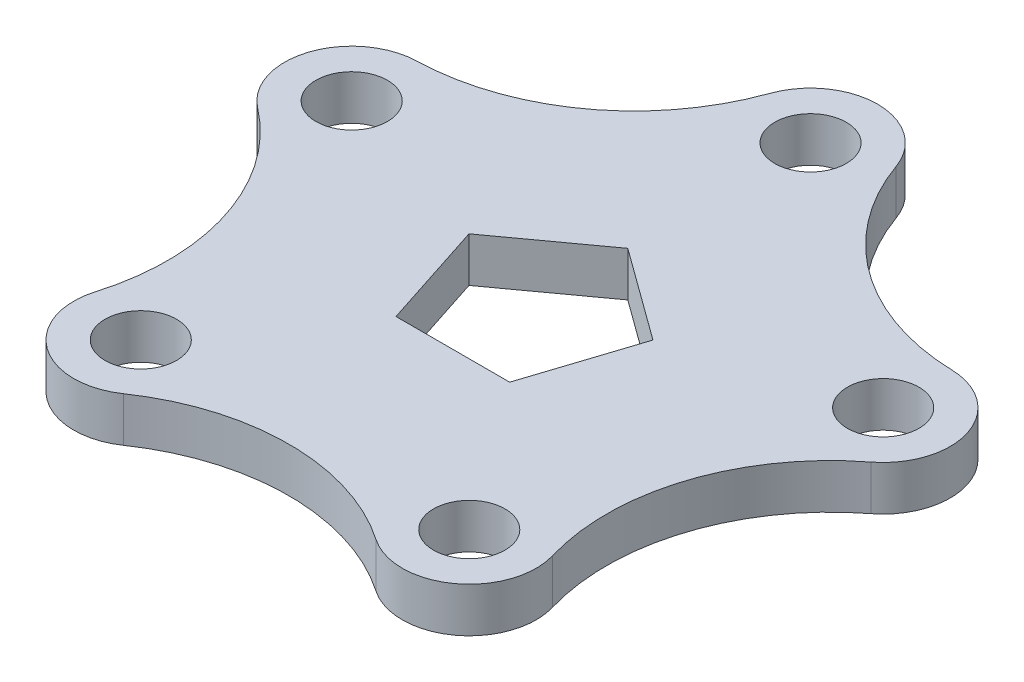
ISO-10303-21;
HEADER;
FILE_DESCRIPTION(('STEP AP214'),'2;1');
FILE_NAME('part.step','',(''),(''),'','','');
FILE_SCHEMA(('AUTOMOTIVE_DESIGN { 1 0 10303 214 1 1 1 1 }'));
ENDSEC;
DATA;
#1=APPLICATION_CONTEXT('core data for automotive mechanical design processes');
#2=APPLICATION_PROTOCOL_DEFINITION('international standard','automotive_design',2000,#1);
#3=PRODUCT_CONTEXT('',#1,'mechanical');
#4=PRODUCT('Part','Part','',(#3));
#5=PRODUCT_RELATED_PRODUCT_CATEGORY('part','',(#4));
#6=PRODUCT_DEFINITION_FORMATION('','',#4);
#7=PRODUCT_DEFINITION_CONTEXT('part definition',#1,'design');
#8=PRODUCT_DEFINITION('design','',#6,#7);
#9=PRODUCT_DEFINITION_SHAPE('','',#8);
#10=(LENGTH_UNIT() NAMED_UNIT(*) SI_UNIT(.MILLI.,.METRE.));
#11=(NAMED_UNIT(*) PLANE_ANGLE_UNIT() SI_UNIT($,.RADIAN.));
#12=(NAMED_UNIT(*) SI_UNIT($,.STERADIAN.) SOLID_ANGLE_UNIT());
#13=UNCERTAINTY_MEASURE_WITH_UNIT(LENGTH_MEASURE(1.E-05),#10,'distance_accuracy_value','');
#14=(GEOMETRIC_REPRESENTATION_CONTEXT(3) GLOBAL_UNCERTAINTY_ASSIGNED_CONTEXT((#13)) GLOBAL_UNIT_ASSIGNED_CONTEXT((#10,
#11,#12)) REPRESENTATION_CONTEXT('',''));
#15=CARTESIAN_POINT('',(0.,0.,0.));
#16=DIRECTION('',(0.,0.,1.));
#17=DIRECTION('',(1.,0.,0.));
#18=AXIS2_PLACEMENT_3D('',#15,#16,#17);
#19=CARTESIAN_POINT('',(10.2862419151183,10.,-14.1577974015616));
#20=DIRECTION('',(-0.587785252292472,0.,0.809016994374948));
#21=DIRECTION('',(0.809016994374948,0.,0.587785252292472));
#22=AXIS2_PLACEMENT_3D('',#19,#20,#21);
#23=PLANE('',#22);
#24=DIRECTION('',(-0.809016994374948,0.,-0.587785252292472));
#25=VECTOR('',#24,1.);
#26=CARTESIAN_POINT('',(10.2862419151183,0.,-14.1577974015616));
#27=LINE('',#26,#25);
#28=CARTESIAN_POINT('',(20.5724838302366,0.,-6.68440519687687));
#29=VERTEX_POINT('',#28);
#30=CARTESIAN_POINT('',(0.,0.,-21.6311896062463));
#31=VERTEX_POINT('',#30);
#32=EDGE_CURVE('E253',#29,#31,#27,.T.);
#33=ORIENTED_EDGE('',*,*,#32,.F.);
#34=DIRECTION('',(0.,-1.,0.));
#35=VECTOR('',#34,1.);
#36=CARTESIAN_POINT('',(20.5724838302366,10.,-6.68440519687687));
#37=LINE('',#36,#35);
#38=CARTESIAN_POINT('',(20.5724838302366,10.,-6.68440519687687));
#39=VERTEX_POINT('',#38);
#40=EDGE_CURVE('E11',#39,#29,#37,.T.);
#41=ORIENTED_EDGE('',*,*,#40,.F.);
#42=DIRECTION('',(-0.809016994374948,0.,-0.587785252292472));
#43=VECTOR('',#42,1.);
#44=CARTESIAN_POINT('',(10.2862419151183,10.,-14.1577974015616));
#45=LINE('',#44,#43);
#46=CARTESIAN_POINT('',(0.,10.,-21.6311896062463));
#47=VERTEX_POINT('',#46);
#48=EDGE_CURVE('E397',#39,#47,#45,.T.);
#49=ORIENTED_EDGE('',*,*,#48,.T.);
#50=DIRECTION('',(0.,-1.,0.));
#51=VECTOR('',#50,1.);
#52=CARTESIAN_POINT('',(0.,10.,-21.6311896062463));
#53=LINE('',#52,#51);
#54=EDGE_CURVE('E70',#47,#31,#53,.T.);
#55=ORIENTED_EDGE('',*,*,#54,.T.);
#56=EDGE_LOOP('',(#33,#41,#49,#55));
#57=FACE_BOUND('',#56,.T.);
#58=ADVANCED_FACE('F50',(#57),#23,.T.);
#59=CARTESIAN_POINT('',(16.6434890351652,10.,5.40779740156155));
#60=DIRECTION('',(-0.951056516295154,0.,-0.309016994374946));
#61=DIRECTION('',(-0.309016994374946,0.,0.951056516295154));
#62=AXIS2_PLACEMENT_3D('',#59,#60,#61);
#63=PLANE('',#62);
#64=DIRECTION('',(0.309016994374946,0.,-0.951056516295154));
#65=VECTOR('',#64,1.);
#66=CARTESIAN_POINT('',(16.6434890351652,0.,5.40779740156155));
#67=LINE('',#66,#65);
#68=CARTESIAN_POINT('',(12.7144942400938,0.,17.5));
#69=VERTEX_POINT('',#68);
#70=EDGE_CURVE('E257',#69,#29,#67,.T.);
#71=ORIENTED_EDGE('',*,*,#70,.F.);
#72=DIRECTION('',(0.,-1.,0.));
#73=VECTOR('',#72,1.);
#74=CARTESIAN_POINT('',(12.7144942400938,10.,17.5));
#75=LINE('',#74,#73);
#76=CARTESIAN_POINT('',(12.7144942400938,10.,17.5));
#77=VERTEX_POINT('',#76);
#78=EDGE_CURVE('E59',#77,#69,#75,.T.);
#79=ORIENTED_EDGE('',*,*,#78,.F.);
#80=DIRECTION('',(0.309016994374946,0.,-0.951056516295154));
#81=VECTOR('',#80,1.);
#82=CARTESIAN_POINT('',(16.6434890351652,10.,5.40779740156155));
#83=LINE('',#82,#81);
#84=EDGE_CURVE('E185',#77,#39,#83,.T.);
#85=ORIENTED_EDGE('',*,*,#84,.T.);
#86=ORIENTED_EDGE('',*,*,#40,.T.);
#87=EDGE_LOOP('',(#71,#79,#85,#86));
#88=FACE_BOUND('',#87,.T.);
#89=ADVANCED_FACE('F404',(#88),#63,.T.);
#90=CARTESIAN_POINT('',(0.,10.,17.5));
#91=DIRECTION('',(0.,0.,-1.));
#92=DIRECTION('',(-1.,0.,0.));
#93=AXIS2_PLACEMENT_3D('',#90,#91,#92);
#94=PLANE('',#93);
#95=DIRECTION('',(1.,0.,0.));
#96=VECTOR('',#95,1.);
#97=CARTESIAN_POINT('',(0.,0.,17.5));
#98=LINE('',#97,#96);
#99=CARTESIAN_POINT('',(-12.7144942400938,0.,17.5));
#100=VERTEX_POINT('',#99);
#101=EDGE_CURVE('E167',#100,#69,#98,.T.);
#102=ORIENTED_EDGE('',*,*,#101,.F.);
#103=DIRECTION('',(0.,-1.,0.));
#104=VECTOR('',#103,1.);
#105=CARTESIAN_POINT('',(-12.7144942400938,10.,17.5));
#106=LINE('',#105,#104);
#107=CARTESIAN_POINT('',(-12.7144942400938,10.,17.5));
#108=VERTEX_POINT('',#107);
#109=EDGE_CURVE('E162',#108,#100,#106,.T.);
#110=ORIENTED_EDGE('',*,*,#109,.F.);
#111=DIRECTION('',(1.,0.,0.));
#112=VECTOR('',#111,1.);
#113=CARTESIAN_POINT('',(0.,10.,17.5));
#114=LINE('',#113,#112);
#115=EDGE_CURVE('E165',#108,#77,#114,.T.);
#116=ORIENTED_EDGE('',*,*,#115,.T.);
#117=ORIENTED_EDGE('',*,*,#78,.T.);
#118=EDGE_LOOP('',(#102,#110,#116,#117));
#119=FACE_BOUND('',#118,.T.);
#120=ADVANCED_FACE('F163',(#119),#94,.T.);
#121=CARTESIAN_POINT('',(-16.6434890351652,10.,5.4077974015616));
#122=DIRECTION('',(0.951056516295153,0.,-0.309016994374949));
#123=DIRECTION('',(-0.309016994374949,0.,-0.951056516295153));
#124=AXIS2_PLACEMENT_3D('',#121,#122,#123);
#125=PLANE('',#124);
#126=DIRECTION('',(0.309016994374949,0.,0.951056516295153));
#127=VECTOR('',#126,1.);
#128=CARTESIAN_POINT('',(-16.6434890351652,0.,5.4077974015616));
#129=LINE('',#128,#127);
#130=CARTESIAN_POINT('',(-20.5724838302366,0.,-6.68440519687681));
#131=VERTEX_POINT('',#130);
#132=EDGE_CURVE('E261',#131,#100,#129,.T.);
#133=ORIENTED_EDGE('',*,*,#132,.F.);
#134=DIRECTION('',(0.,-1.,0.));
#135=VECTOR('',#134,1.);
#136=CARTESIAN_POINT('',(-20.5724838302366,10.,-6.68440519687681));
#137=LINE('',#136,#135);
#138=CARTESIAN_POINT('',(-20.5724838302366,10.,-6.68440519687681));
#139=VERTEX_POINT('',#138);
#140=EDGE_CURVE('E111',#139,#131,#137,.T.);
#141=ORIENTED_EDGE('',*,*,#140,.F.);
#142=DIRECTION('',(0.309016994374949,0.,0.951056516295153));
#143=VECTOR('',#142,1.);
#144=CARTESIAN_POINT('',(-16.6434890351652,10.,5.4077974015616));
#145=LINE('',#144,#143);
#146=EDGE_CURVE('E179',#139,#108,#145,.T.);
#147=ORIENTED_EDGE('',*,*,#146,.T.);
#148=ORIENTED_EDGE('',*,*,#109,.T.);
#149=EDGE_LOOP('',(#133,#141,#147,#148));
#150=FACE_BOUND('',#149,.T.);
#151=ADVANCED_FACE('F184',(#150),#125,.T.);
#152=CARTESIAN_POINT('',(-61.2393120472351,10.,-84.288681923909));
#153=DIRECTION('',(0.,-1.,0.));
#154=DIRECTION('',(0.,0.,-1.));
#155=AXIS2_PLACEMENT_3D('',#152,#153,#154);
#156=CYLINDRICAL_SURFACE('',#155,50.);
#157=CARTESIAN_POINT('',(-61.2393120472351,0.,-84.288681923909));
#158=DIRECTION('',(0.,1.,0.));
#159=DIRECTION('',(0.,0.,1.));
#160=AXIS2_PLACEMENT_3D('',#157,#158,#159);
#161=CIRCLE('',#160,50.);
#162=CARTESIAN_POINT('',(-59.8560199097059,0.,-34.3078205581591));
#163=VERTEX_POINT('',#162);
#164=CARTESIAN_POINT('',(-14.1321489339774,0.,-67.528157367056));
#165=VERTEX_POINT('',#164);
#166=EDGE_CURVE('E215',#163,#165,#161,.T.);
#167=ORIENTED_EDGE('',*,*,#166,.F.);
#168=DIRECTION('',(0.,-1.,0.));
#169=VECTOR('',#168,1.);
#170=CARTESIAN_POINT('',(-59.8560199097059,10.,-34.3078205581591));
#171=LINE('',#170,#169);
#172=CARTESIAN_POINT('',(-59.8560199097059,10.,-34.3078205581591));
#173=VERTEX_POINT('',#172);
#174=EDGE_CURVE('E51',#173,#163,#171,.T.);
#175=ORIENTED_EDGE('',*,*,#174,.F.);
#176=CARTESIAN_POINT('',(-61.2393120472351,10.,-84.288681923909));
#177=DIRECTION('',(0.,1.,0.));
#178=DIRECTION('',(0.,0.,1.));
#179=AXIS2_PLACEMENT_3D('',#176,#177,#178);
#180=CIRCLE('',#179,50.);
#181=CARTESIAN_POINT('',(-14.1321489339774,10.,-67.528157367056));
#182=VERTEX_POINT('',#181);
#183=EDGE_CURVE('E290',#173,#182,#180,.T.);
#184=ORIENTED_EDGE('',*,*,#183,.T.);
#185=DIRECTION('',(0.,-1.,0.));
#186=VECTOR('',#185,1.);
#187=CARTESIAN_POINT('',(-14.1321489339774,10.,-67.528157367056));
#188=LINE('',#187,#186);
#189=EDGE_CURVE('E211',#182,#165,#188,.T.);
#190=ORIENTED_EDGE('',*,*,#189,.T.);
#191=EDGE_LOOP('',(#167,#175,#184,#190));
#192=FACE_BOUND('',#191,.T.);
#193=ADVANCED_FACE('F47',(#192),#156,.F.);
#194=CARTESIAN_POINT('',(-59.4410322684471,10.,-19.3135621484342));
#195=DIRECTION('',(0.,-1.,0.));
#196=DIRECTION('',(0.,0.,-1.));
#197=AXIS2_PLACEMENT_3D('',#194,#195,#196);
#198=CYLINDRICAL_SURFACE('',#197,15.);
#199=CARTESIAN_POINT('',(-59.4410322684471,0.,-19.3135621484342));
#200=DIRECTION('',(0.,1.,0.));
#201=DIRECTION('',(0.,0.,1.));
#202=AXIS2_PLACEMENT_3D('',#199,#200,#201);
#203=CIRCLE('',#202,15.);
#204=CARTESIAN_POINT('',(-68.5901682849799,0.,-7.42687589233322));
#205=VERTEX_POINT('',#204);
#206=EDGE_CURVE('E216',#163,#205,#203,.T.);
#207=ORIENTED_EDGE('',*,*,#206,.T.);
#208=DIRECTION('',(0.,-1.,0.));
#209=VECTOR('',#208,1.);
#210=CARTESIAN_POINT('',(-68.5901682849799,10.,-7.42687589233322));
#211=LINE('',#210,#209);
#212=CARTESIAN_POINT('',(-68.5901682849799,10.,-7.42687589233322));
#213=VERTEX_POINT('',#212);
#214=EDGE_CURVE('E317',#213,#205,#211,.T.);
#215=ORIENTED_EDGE('',*,*,#214,.F.);
#216=CARTESIAN_POINT('',(-59.4410322684471,10.,-19.3135621484342));
#217=DIRECTION('',(0.,1.,0.));
#218=DIRECTION('',(0.,0.,1.));
#219=AXIS2_PLACEMENT_3D('',#216,#217,#218);
#220=CIRCLE('',#219,15.);
#221=EDGE_CURVE('E326',#173,#213,#220,.T.);
#222=ORIENTED_EDGE('',*,*,#221,.F.);
#223=ORIENTED_EDGE('',*,*,#174,.T.);
#224=EDGE_LOOP('',(#207,#215,#222,#223));
#225=FACE_BOUND('',#224,.T.);
#226=ADVANCED_FACE('F329',(#225),#198,.T.);
#227=CARTESIAN_POINT('',(-99.0872883400891,10.,32.1954116280032));
#228=DIRECTION('',(0.,-1.,0.));
#229=DIRECTION('',(0.,0.,-1.));
#230=AXIS2_PLACEMENT_3D('',#227,#228,#229);
#231=CYLINDRICAL_SURFACE('',#230,50.);
#232=CARTESIAN_POINT('',(-99.0872883400891,0.,32.1954116280032));
#233=DIRECTION('',(0.,1.,0.));
#234=DIRECTION('',(0.,0.,1.));
#235=AXIS2_PLACEMENT_3D('',#232,#233,#234);
#236=CIRCLE('',#235,50.);
#237=CARTESIAN_POINT('',(-51.1252036694663,0.,46.3247581821809));
#238=VERTEX_POINT('',#237);
#239=EDGE_CURVE('E225',#238,#205,#236,.T.);
#240=ORIENTED_EDGE('',*,*,#239,.F.);
#241=DIRECTION('',(0.,-1.,0.));
#242=VECTOR('',#241,1.);
#243=CARTESIAN_POINT('',(-51.1252036694663,10.,46.3247581821809));
#244=LINE('',#243,#242);
#245=CARTESIAN_POINT('',(-51.1252036694663,10.,46.3247581821809));
#246=VERTEX_POINT('',#245);
#247=EDGE_CURVE('E320',#246,#238,#244,.T.);
#248=ORIENTED_EDGE('',*,*,#247,.F.);
#249=CARTESIAN_POINT('',(-99.0872883400891,10.,32.1954116280032));
#250=DIRECTION('',(0.,1.,0.));
#251=DIRECTION('',(0.,0.,1.));
#252=AXIS2_PLACEMENT_3D('',#249,#250,#251);
#253=CIRCLE('',#252,50.);
#254=EDGE_CURVE('E371',#246,#213,#253,.T.);
#255=ORIENTED_EDGE('',*,*,#254,.T.);
#256=ORIENTED_EDGE('',*,*,#214,.T.);
#257=EDGE_LOOP('',(#240,#248,#255,#256));
#258=FACE_BOUND('',#257,.T.);
#259=ADVANCED_FACE('F375',(#258),#231,.F.);
#260=CARTESIAN_POINT('',(-36.7365782682796,10.,50.5635621484342));
#261=DIRECTION('',(0.,-1.,0.));
#262=DIRECTION('',(0.,0.,-1.));
#263=AXIS2_PLACEMENT_3D('',#260,#261,#262);
#264=CYLINDRICAL_SURFACE('',#263,15.);
#265=CARTESIAN_POINT('',(-36.7365782682796,0.,50.5635621484342));
#266=DIRECTION('',(0.,1.,0.));
#267=DIRECTION('',(0.,0.,1.));
#268=AXIS2_PLACEMENT_3D('',#265,#266,#267);
#269=CIRCLE('',#268,15.);
#270=CARTESIAN_POINT('',(-28.2589063602152,0.,62.9380956353668));
#271=VERTEX_POINT('',#270);
#272=EDGE_CURVE('E226',#238,#271,#269,.T.);
#273=ORIENTED_EDGE('',*,*,#272,.T.);
#274=DIRECTION('',(0.,-1.,0.));
#275=VECTOR('',#274,1.);
#276=CARTESIAN_POINT('',(-28.2589063602152,10.,62.9380956353668));
#277=LINE('',#276,#275);
#278=CARTESIAN_POINT('',(-28.2589063602152,10.,62.9380956353668));
#279=VERTEX_POINT('',#278);
#280=EDGE_CURVE('E312',#279,#271,#277,.T.);
#281=ORIENTED_EDGE('',*,*,#280,.F.);
#282=CARTESIAN_POINT('',(-36.7365782682796,10.,50.5635621484342));
#283=DIRECTION('',(0.,1.,0.));
#284=DIRECTION('',(0.,0.,1.));
#285=AXIS2_PLACEMENT_3D('',#282,#283,#284);
#286=CIRCLE('',#285,15.);
#287=EDGE_CURVE('E373',#246,#279,#286,.T.);
#288=ORIENTED_EDGE('',*,*,#287,.F.);
#289=ORIENTED_EDGE('',*,*,#247,.T.);
#290=EDGE_LOOP('',(#273,#281,#288,#289));
#291=FACE_BOUND('',#290,.T.);
#292=ADVANCED_FACE('F372',(#291),#264,.T.);
#293=CARTESIAN_POINT('',(-5.96744875736022E-13,10.,104.186540591808));
#294=DIRECTION('',(0.,-1.,0.));
#295=DIRECTION('',(0.,0.,-1.));
#296=AXIS2_PLACEMENT_3D('',#293,#294,#295);
#297=CYLINDRICAL_SURFACE('',#296,50.);
#298=CARTESIAN_POINT('',(-5.96744875736022E-13,0.,104.186540591808));
#299=DIRECTION('',(0.,1.,0.));
#300=DIRECTION('',(0.,0.,1.));
#301=AXIS2_PLACEMENT_3D('',#298,#299,#300);
#302=CIRCLE('',#301,50.);
#303=CARTESIAN_POINT('',(28.258906360215,0.,62.9380956353667));
#304=VERTEX_POINT('',#303);
#305=EDGE_CURVE('E229',#304,#271,#302,.T.);
#306=ORIENTED_EDGE('',*,*,#305,.F.);
#307=DIRECTION('',(0.,-1.,0.));
#308=VECTOR('',#307,1.);
#309=CARTESIAN_POINT('',(28.258906360215,10.,62.9380956353667));
#310=LINE('',#309,#308);
#311=CARTESIAN_POINT('',(28.258906360215,10.,62.9380956353667));
#312=VERTEX_POINT('',#311);
#313=EDGE_CURVE('E311',#312,#304,#310,.T.);
#314=ORIENTED_EDGE('',*,*,#313,.F.);
#315=CARTESIAN_POINT('',(-5.96744875736022E-13,10.,104.186540591808));
#316=DIRECTION('',(0.,1.,0.));
#317=DIRECTION('',(0.,0.,1.));
#318=AXIS2_PLACEMENT_3D('',#315,#316,#317);
#319=CIRCLE('',#318,50.);
#320=EDGE_CURVE('E367',#312,#279,#319,.T.);
#321=ORIENTED_EDGE('',*,*,#320,.T.);
#322=ORIENTED_EDGE('',*,*,#280,.T.);
#323=EDGE_LOOP('',(#306,#314,#321,#322));
#324=FACE_BOUND('',#323,.T.);
#325=ADVANCED_FACE('F362',(#324),#297,.F.);
#326=CARTESIAN_POINT('',(36.7365782682796,10.,50.5635621484342));
#327=DIRECTION('',(0.,-1.,0.));
#328=DIRECTION('',(0.,0.,-1.));
#329=AXIS2_PLACEMENT_3D('',#326,#327,#328);
#330=CYLINDRICAL_SURFACE('',#329,15.);
#331=CARTESIAN_POINT('',(36.7365782682796,0.,50.5635621484342));
#332=DIRECTION('',(0.,1.,0.));
#333=DIRECTION('',(0.,0.,1.));
#334=AXIS2_PLACEMENT_3D('',#331,#332,#333);
#335=CIRCLE('',#334,15.);
#336=CARTESIAN_POINT('',(51.1252036694663,0.,46.3247581821811));
#337=VERTEX_POINT('',#336);
#338=EDGE_CURVE('E233',#304,#337,#335,.T.);
#339=ORIENTED_EDGE('',*,*,#338,.T.);
#340=DIRECTION('',(0.,-1.,0.));
#341=VECTOR('',#340,1.);
#342=CARTESIAN_POINT('',(51.1252036694663,10.,46.3247581821811));
#343=LINE('',#342,#341);
#344=CARTESIAN_POINT('',(51.1252036694663,10.,46.3247581821811));
#345=VERTEX_POINT('',#344);
#346=EDGE_CURVE('E306',#345,#337,#343,.T.);
#347=ORIENTED_EDGE('',*,*,#346,.F.);
#348=CARTESIAN_POINT('',(36.7365782682796,10.,50.5635621484342));
#349=DIRECTION('',(0.,1.,0.));
#350=DIRECTION('',(0.,0.,1.));
#351=AXIS2_PLACEMENT_3D('',#348,#349,#350);
#352=CIRCLE('',#351,15.);
#353=EDGE_CURVE('E387',#312,#345,#352,.T.);
#354=ORIENTED_EDGE('',*,*,#353,.F.);
#355=ORIENTED_EDGE('',*,*,#313,.T.);
#356=EDGE_LOOP('',(#339,#347,#354,#355));
#357=FACE_BOUND('',#356,.T.);
#358=ADVANCED_FACE('F361',(#357),#330,.T.);
#359=CARTESIAN_POINT('',(99.0872883400888,10.,32.1954116280044));
#360=DIRECTION('',(0.,-1.,0.));
#361=DIRECTION('',(0.,0.,-1.));
#362=AXIS2_PLACEMENT_3D('',#359,#360,#361);
#363=CYLINDRICAL_SURFACE('',#362,50.);
#364=CARTESIAN_POINT('',(99.0872883400888,0.,32.1954116280044));
#365=DIRECTION('',(0.,1.,0.));
#366=DIRECTION('',(0.,0.,1.));
#367=AXIS2_PLACEMENT_3D('',#364,#365,#366);
#368=CIRCLE('',#367,50.);
#369=CARTESIAN_POINT('',(68.5901682849798,0.,-7.42687589233313));
#370=VERTEX_POINT('',#369);
#371=EDGE_CURVE('E239',#370,#337,#368,.T.);
#372=ORIENTED_EDGE('',*,*,#371,.F.);
#373=DIRECTION('',(0.,-1.,0.));
#374=VECTOR('',#373,1.);
#375=CARTESIAN_POINT('',(68.5901682849798,10.,-7.42687589233313));
#376=LINE('',#375,#374);
#377=CARTESIAN_POINT('',(68.5901682849798,10.,-7.42687589233313));
#378=VERTEX_POINT('',#377);
#379=EDGE_CURVE('E304',#378,#370,#376,.T.);
#380=ORIENTED_EDGE('',*,*,#379,.F.);
#381=CARTESIAN_POINT('',(99.0872883400888,10.,32.1954116280044));
#382=DIRECTION('',(0.,1.,0.));
#383=DIRECTION('',(0.,0.,1.));
#384=AXIS2_PLACEMENT_3D('',#381,#382,#383);
#385=CIRCLE('',#384,50.);
#386=EDGE_CURVE('E358',#378,#345,#385,.T.);
#387=ORIENTED_EDGE('',*,*,#386,.T.);
#388=ORIENTED_EDGE('',*,*,#346,.T.);
#389=EDGE_LOOP('',(#372,#380,#387,#388));
#390=FACE_BOUND('',#389,.T.);
#391=ADVANCED_FACE('F354',(#390),#363,.F.);
#392=CARTESIAN_POINT('',(59.4410322684472,10.,-19.3135621484343));
#393=DIRECTION('',(0.,-1.,0.));
#394=DIRECTION('',(0.,0.,-1.));
#395=AXIS2_PLACEMENT_3D('',#392,#393,#394);
#396=CYLINDRICAL_SURFACE('',#395,14.9999999999999);
#397=CARTESIAN_POINT('',(59.4410322684472,0.,-19.3135621484343));
#398=DIRECTION('',(0.,1.,0.));
#399=DIRECTION('',(0.,0.,1.));
#400=AXIS2_PLACEMENT_3D('',#397,#398,#399);
#401=CIRCLE('',#400,14.9999999999999);
#402=CARTESIAN_POINT('',(59.8560199097062,0.,-34.307820558159));
#403=VERTEX_POINT('',#402);
#404=EDGE_CURVE('E242',#370,#403,#401,.T.);
#405=ORIENTED_EDGE('',*,*,#404,.T.);
#406=DIRECTION('',(0.,-1.,0.));
#407=VECTOR('',#406,1.);
#408=CARTESIAN_POINT('',(59.8560199097062,10.,-34.307820558159));
#409=LINE('',#408,#407);
#410=CARTESIAN_POINT('',(59.8560199097062,10.,-34.307820558159));
#411=VERTEX_POINT('',#410);
#412=EDGE_CURVE('E302',#411,#403,#409,.T.);
#413=ORIENTED_EDGE('',*,*,#412,.F.);
#414=CARTESIAN_POINT('',(59.4410322684472,10.,-19.3135621484343));
#415=DIRECTION('',(0.,1.,0.));
#416=DIRECTION('',(0.,0.,1.));
#417=AXIS2_PLACEMENT_3D('',#414,#415,#416);
#418=CIRCLE('',#417,14.9999999999999);
#419=EDGE_CURVE('E392',#378,#411,#418,.T.);
#420=ORIENTED_EDGE('',*,*,#419,.F.);
#421=ORIENTED_EDGE('',*,*,#379,.T.);
#422=EDGE_LOOP('',(#405,#413,#420,#421));
#423=FACE_BOUND('',#422,.T.);
#424=ADVANCED_FACE('F349',(#423),#396,.T.);
#425=CARTESIAN_POINT('',(61.2393120472361,10.,-84.2886819239083));
#426=DIRECTION('',(0.,-1.,0.));
#427=DIRECTION('',(0.,0.,-1.));
#428=AXIS2_PLACEMENT_3D('',#425,#426,#427);
#429=CYLINDRICAL_SURFACE('',#428,50.);
#430=CARTESIAN_POINT('',(61.2393120472361,0.,-84.2886819239083));
#431=DIRECTION('',(0.,1.,0.));
#432=DIRECTION('',(0.,0.,1.));
#433=AXIS2_PLACEMENT_3D('',#430,#431,#432);
#434=CIRCLE('',#433,50.);
#435=CARTESIAN_POINT('',(14.1321489339775,0.,-67.5281573670558));
#436=VERTEX_POINT('',#435);
#437=EDGE_CURVE('E247',#436,#403,#434,.T.);
#438=ORIENTED_EDGE('',*,*,#437,.F.);
#439=DIRECTION('',(0.,-1.,0.));
#440=VECTOR('',#439,1.);
#441=CARTESIAN_POINT('',(14.1321489339775,10.,-67.5281573670558));
#442=LINE('',#441,#440);
#443=CARTESIAN_POINT('',(14.1321489339775,10.,-67.5281573670558));
#444=VERTEX_POINT('',#443);
#445=EDGE_CURVE('E298',#444,#436,#442,.T.);
#446=ORIENTED_EDGE('',*,*,#445,.F.);
#447=CARTESIAN_POINT('',(61.2393120472361,10.,-84.2886819239083));
#448=DIRECTION('',(0.,1.,0.));
#449=DIRECTION('',(0.,0.,1.));
#450=AXIS2_PLACEMENT_3D('',#447,#448,#449);
#451=CIRCLE('',#450,50.);
#452=EDGE_CURVE('E347',#444,#411,#451,.T.);
#453=ORIENTED_EDGE('',*,*,#452,.T.);
#454=ORIENTED_EDGE('',*,*,#412,.T.);
#455=EDGE_LOOP('',(#438,#446,#453,#454));
#456=FACE_BOUND('',#455,.T.);
#457=ADVANCED_FACE('F344',(#456),#429,.F.);
#458=CARTESIAN_POINT('',(-36.73657826828,10.,50.5635621484339));
#459=DIRECTION('',(0.,-1.,0.));
#460=DIRECTION('',(0.,0.,-1.));
#461=AXIS2_PLACEMENT_3D('',#458,#459,#460);
#462=CYLINDRICAL_SURFACE('',#461,8.);
#463=CARTESIAN_POINT('',(-36.73657826828,10.,50.5635621484339));
#464=DIRECTION('',(0.,1.,0.));
#465=DIRECTION('',(0.,0.,1.));
#466=AXIS2_PLACEMENT_3D('',#463,#464,#465);
#467=CIRCLE('',#466,8.);
#468=CARTESIAN_POINT('',(-36.73657826828,10.,58.5635621484339));
#469=VERTEX_POINT('',#468);
#470=EDGE_CURVE('E203',#469,#469,#467,.T.);
#471=ORIENTED_EDGE('',*,*,#470,.T.);
#472=EDGE_LOOP('',(#471));
#473=FACE_BOUND('',#472,.T.);
#474=CARTESIAN_POINT('',(-36.73657826828,0.,50.5635621484339));
#475=DIRECTION('',(0.,1.,0.));
#476=DIRECTION('',(0.,0.,1.));
#477=AXIS2_PLACEMENT_3D('',#474,#475,#476);
#478=CIRCLE('',#477,8.);
#479=CARTESIAN_POINT('',(-36.73657826828,0.,58.5635621484339));
#480=VERTEX_POINT('',#479);
#481=EDGE_CURVE('E285',#480,#480,#478,.T.);
#482=ORIENTED_EDGE('',*,*,#481,.F.);
#483=EDGE_LOOP('',(#482));
#484=FACE_BOUND('',#483,.T.);
#485=ADVANCED_FACE('F431',(#473,#484),#462,.F.);
#486=CARTESIAN_POINT('',(36.7365782682793,10.,50.5635621484344));
#487=DIRECTION('',(0.,-1.,0.));
#488=DIRECTION('',(0.,0.,-1.));
#489=AXIS2_PLACEMENT_3D('',#486,#487,#488);
#490=CYLINDRICAL_SURFACE('',#489,8.);
#491=CARTESIAN_POINT('',(36.7365782682793,10.,50.5635621484344));
#492=DIRECTION('',(0.,1.,0.));
#493=DIRECTION('',(0.,0.,1.));
#494=AXIS2_PLACEMENT_3D('',#491,#492,#493);
#495=CIRCLE('',#494,8.);
#496=CARTESIAN_POINT('',(36.7365782682793,10.,58.5635621484344));
#497=VERTEX_POINT('',#496);
#498=EDGE_CURVE('E202',#497,#497,#495,.T.);
#499=ORIENTED_EDGE('',*,*,#498,.T.);
#500=EDGE_LOOP('',(#499));
#501=FACE_BOUND('',#500,.T.);
#502=CARTESIAN_POINT('',(36.7365782682793,0.,50.5635621484344));
#503=DIRECTION('',(0.,1.,0.));
#504=DIRECTION('',(0.,0.,1.));
#505=AXIS2_PLACEMENT_3D('',#502,#503,#504);
#506=CIRCLE('',#505,8.);
#507=CARTESIAN_POINT('',(36.7365782682793,0.,58.5635621484344));
#508=VERTEX_POINT('',#507);
#509=EDGE_CURVE('E277',#508,#508,#506,.T.);
#510=ORIENTED_EDGE('',*,*,#509,.F.);
#511=EDGE_LOOP('',(#510));
#512=FACE_BOUND('',#511,.T.);
#513=ADVANCED_FACE('F521',(#501,#512),#490,.F.);
#514=CARTESIAN_POINT('',(59.4410322684472,10.,-19.3135621484343));
#515=DIRECTION('',(0.,-1.,0.));
#516=DIRECTION('',(0.,0.,-1.));
#517=AXIS2_PLACEMENT_3D('',#514,#515,#516);
#518=CYLINDRICAL_SURFACE('',#517,8.00000000000018);
#519=CARTESIAN_POINT('',(59.4410322684472,10.,-19.3135621484343));
#520=DIRECTION('',(0.,1.,0.));
#521=DIRECTION('',(0.,0.,1.));
#522=AXIS2_PLACEMENT_3D('',#519,#520,#521);
#523=CIRCLE('',#522,8.00000000000018);
#524=CARTESIAN_POINT('',(59.4410322684472,10.,-11.3135621484341));
#525=VERTEX_POINT('',#524);
#526=EDGE_CURVE('E197',#525,#525,#523,.T.);
#527=ORIENTED_EDGE('',*,*,#526,.T.);
#528=EDGE_LOOP('',(#527));
#529=FACE_BOUND('',#528,.T.);
#530=CARTESIAN_POINT('',(59.4410322684472,0.,-19.3135621484343));
#531=DIRECTION('',(0.,1.,0.));
#532=DIRECTION('',(0.,0.,1.));
#533=AXIS2_PLACEMENT_3D('',#530,#531,#532);
#534=CIRCLE('',#533,8.00000000000018);
#535=CARTESIAN_POINT('',(59.4410322684472,0.,-11.3135621484341));
#536=VERTEX_POINT('',#535);
#537=EDGE_CURVE('E272',#536,#536,#534,.T.);
#538=ORIENTED_EDGE('',*,*,#537,.F.);
#539=EDGE_LOOP('',(#538));
#540=FACE_BOUND('',#539,.T.);
#541=ADVANCED_FACE('F420',(#529,#540),#518,.F.);
#542=CARTESIAN_POINT('',(0.,10.,-62.5000000000001));
#543=DIRECTION('',(0.,-1.,0.));
#544=DIRECTION('',(0.,0.,-1.));
#545=AXIS2_PLACEMENT_3D('',#542,#543,#544);
#546=CYLINDRICAL_SURFACE('',#545,7.99999999999997);
#547=CARTESIAN_POINT('',(0.,10.,-62.5000000000001));
#548=DIRECTION('',(0.,1.,0.));
#549=DIRECTION('',(0.,0.,1.));
#550=AXIS2_PLACEMENT_3D('',#547,#548,#549);
#551=CIRCLE('',#550,7.99999999999997);
#552=CARTESIAN_POINT('',(0.,10.,-54.5000000000001));
#553=VERTEX_POINT('',#552);
#554=EDGE_CURVE('E189',#553,#553,#551,.T.);
#555=ORIENTED_EDGE('',*,*,#554,.T.);
#556=EDGE_LOOP('',(#555));
#557=FACE_BOUND('',#556,.T.);
#558=CARTESIAN_POINT('',(0.,0.,-62.5000000000001));
#559=DIRECTION('',(0.,1.,0.));
#560=DIRECTION('',(0.,0.,1.));
#561=AXIS2_PLACEMENT_3D('',#558,#559,#560);
#562=CIRCLE('',#561,7.99999999999997);
#563=CARTESIAN_POINT('',(0.,0.,-54.5000000000001));
#564=VERTEX_POINT('',#563);
#565=EDGE_CURVE('E269',#564,#564,#562,.T.);
#566=ORIENTED_EDGE('',*,*,#565,.F.);
#567=EDGE_LOOP('',(#566));
#568=FACE_BOUND('',#567,.T.);
#569=ADVANCED_FACE('F407',(#557,#568),#546,.F.);
#570=CARTESIAN_POINT('',(-10.2862419151183,10.,-14.1577974015616));
#571=DIRECTION('',(0.587785252292474,0.,0.809016994374947));
#572=DIRECTION('',(0.809016994374947,0.,-0.587785252292474));
#573=AXIS2_PLACEMENT_3D('',#570,#571,#572);
#574=PLANE('',#573);
#575=DIRECTION('',(-0.809016994374947,0.,0.587785252292474));
#576=VECTOR('',#575,1.);
#577=CARTESIAN_POINT('',(-10.2862419151183,0.,-14.1577974015616));
#578=LINE('',#577,#576);
#579=EDGE_CURVE('E266',#31,#131,#578,.T.);
#580=ORIENTED_EDGE('',*,*,#579,.F.);
#581=ORIENTED_EDGE('',*,*,#54,.F.);
#582=DIRECTION('',(-0.809016994374947,0.,0.587785252292474));
#583=VECTOR('',#582,1.);
#584=CARTESIAN_POINT('',(-10.2862419151183,10.,-14.1577974015616));
#585=LINE('',#584,#583);
#586=EDGE_CURVE('E190',#47,#139,#585,.T.);
#587=ORIENTED_EDGE('',*,*,#586,.T.);
#588=ORIENTED_EDGE('',*,*,#140,.T.);
#589=EDGE_LOOP('',(#580,#581,#587,#588));
#590=FACE_BOUND('',#589,.T.);
#591=ADVANCED_FACE('F410',(#590),#574,.T.);
#592=CARTESIAN_POINT('',(0.,10.,-62.5000000000001));
#593=DIRECTION('',(0.,-1.,0.));
#594=DIRECTION('',(0.,0.,-1.));
#595=AXIS2_PLACEMENT_3D('',#592,#593,#594);
#596=CYLINDRICAL_SURFACE('',#595,15.);
#597=CARTESIAN_POINT('',(0.,0.,-62.5000000000001));
#598=DIRECTION('',(0.,1.,0.));
#599=DIRECTION('',(0.,0.,1.));
#600=AXIS2_PLACEMENT_3D('',#597,#598,#599);
#601=CIRCLE('',#600,15.);
#602=EDGE_CURVE('E248',#436,#165,#601,.T.);
#603=ORIENTED_EDGE('',*,*,#602,.T.);
#604=ORIENTED_EDGE('',*,*,#189,.F.);
#605=CARTESIAN_POINT('',(0.,10.,-62.5000000000001));
#606=DIRECTION('',(0.,1.,0.));
#607=DIRECTION('',(0.,0.,1.));
#608=AXIS2_PLACEMENT_3D('',#605,#606,#607);
#609=CIRCLE('',#608,15.);
#610=EDGE_CURVE('E400',#444,#182,#609,.T.);
#611=ORIENTED_EDGE('',*,*,#610,.F.);
#612=ORIENTED_EDGE('',*,*,#445,.T.);
#613=EDGE_LOOP('',(#603,#604,#611,#612));
#614=FACE_BOUND('',#613,.T.);
#615=ADVANCED_FACE('F339',(#614),#596,.T.);
#616=CARTESIAN_POINT('',(-59.4410322684472,10.,-19.3135621484343));
#617=DIRECTION('',(0.,-1.,0.));
#618=DIRECTION('',(0.,0.,-1.));
#619=AXIS2_PLACEMENT_3D('',#616,#617,#618);
#620=CYLINDRICAL_SURFACE('',#619,8.00000000000064);
#621=CARTESIAN_POINT('',(-59.4410322684472,10.,-19.3135621484343));
#622=DIRECTION('',(0.,1.,0.));
#623=DIRECTION('',(0.,0.,1.));
#624=AXIS2_PLACEMENT_3D('',#621,#622,#623);
#625=CIRCLE('',#624,8.00000000000064);
#626=CARTESIAN_POINT('',(-59.4410322684472,10.,-11.3135621484336));
#627=VERTEX_POINT('',#626);
#628=EDGE_CURVE('E208',#627,#627,#625,.T.);
#629=ORIENTED_EDGE('',*,*,#628,.T.);
#630=EDGE_LOOP('',(#629));
#631=FACE_BOUND('',#630,.T.);
#632=CARTESIAN_POINT('',(-59.4410322684472,0.,-19.3135621484343));
#633=DIRECTION('',(0.,1.,0.));
#634=DIRECTION('',(0.,0.,1.));
#635=AXIS2_PLACEMENT_3D('',#632,#633,#634);
#636=CIRCLE('',#635,8.00000000000064);
#637=CARTESIAN_POINT('',(-59.4410322684472,0.,-11.3135621484336));
#638=VERTEX_POINT('',#637);
#639=EDGE_CURVE('E286',#638,#638,#636,.T.);
#640=ORIENTED_EDGE('',*,*,#639,.F.);
#641=EDGE_LOOP('',(#640));
#642=FACE_BOUND('',#641,.T.);
#643=ADVANCED_FACE('F414',(#631,#642),#620,.F.);
#644=CARTESIAN_POINT('',(0.,10.,0.));
#645=DIRECTION('',(0.,1.,0.));
#646=DIRECTION('',(0.,0.,1.));
#647=AXIS2_PLACEMENT_3D('',#644,#645,#646);
#648=PLANE('',#647);
#649=ORIENTED_EDGE('',*,*,#183,.F.);
#650=ORIENTED_EDGE('',*,*,#221,.T.);
#651=ORIENTED_EDGE('',*,*,#254,.F.);
#652=ORIENTED_EDGE('',*,*,#287,.T.);
#653=ORIENTED_EDGE('',*,*,#320,.F.);
#654=ORIENTED_EDGE('',*,*,#353,.T.);
#655=ORIENTED_EDGE('',*,*,#386,.F.);
#656=ORIENTED_EDGE('',*,*,#419,.T.);
#657=ORIENTED_EDGE('',*,*,#452,.F.);
#658=ORIENTED_EDGE('',*,*,#610,.T.);
#659=EDGE_LOOP('',(#649,#650,#651,#652,#653,#654,#655,#656,#657,#658));
#660=FACE_BOUND('',#659,.T.);
#661=ORIENTED_EDGE('',*,*,#48,.F.);
#662=ORIENTED_EDGE('',*,*,#84,.F.);
#663=ORIENTED_EDGE('',*,*,#115,.F.);
#664=ORIENTED_EDGE('',*,*,#146,.F.);
#665=ORIENTED_EDGE('',*,*,#586,.F.);
#666=EDGE_LOOP('',(#661,#662,#663,#664,#665));
#667=FACE_BOUND('',#666,.T.);
#668=ORIENTED_EDGE('',*,*,#554,.F.);
#669=EDGE_LOOP('',(#668));
#670=FACE_BOUND('',#669,.T.);
#671=ORIENTED_EDGE('',*,*,#526,.F.);
#672=EDGE_LOOP('',(#671));
#673=FACE_BOUND('',#672,.T.);
#674=ORIENTED_EDGE('',*,*,#498,.F.);
#675=EDGE_LOOP('',(#674));
#676=FACE_BOUND('',#675,.T.);
#677=ORIENTED_EDGE('',*,*,#470,.F.);
#678=EDGE_LOOP('',(#677));
#679=FACE_BOUND('',#678,.T.);
#680=ORIENTED_EDGE('',*,*,#628,.F.);
#681=EDGE_LOOP('',(#680));
#682=FACE_BOUND('',#681,.T.);
#683=ADVANCED_FACE('F180',(#660,#667,#670,#673,#676,#679,#682),#648,.T.);
#684=CARTESIAN_POINT('',(0.,0.,0.));
#685=DIRECTION('',(0.,1.,0.));
#686=DIRECTION('',(0.,0.,1.));
#687=AXIS2_PLACEMENT_3D('',#684,#685,#686);
#688=PLANE('',#687);
#689=ORIENTED_EDGE('',*,*,#166,.T.);
#690=ORIENTED_EDGE('',*,*,#602,.F.);
#691=ORIENTED_EDGE('',*,*,#437,.T.);
#692=ORIENTED_EDGE('',*,*,#404,.F.);
#693=ORIENTED_EDGE('',*,*,#371,.T.);
#694=ORIENTED_EDGE('',*,*,#338,.F.);
#695=ORIENTED_EDGE('',*,*,#305,.T.);
#696=ORIENTED_EDGE('',*,*,#272,.F.);
#697=ORIENTED_EDGE('',*,*,#239,.T.);
#698=ORIENTED_EDGE('',*,*,#206,.F.);
#699=EDGE_LOOP('',(#689,#690,#691,#692,#693,#694,#695,#696,#697,#698));
#700=FACE_BOUND('',#699,.T.);
#701=ORIENTED_EDGE('',*,*,#32,.T.);
#702=ORIENTED_EDGE('',*,*,#579,.T.);
#703=ORIENTED_EDGE('',*,*,#132,.T.);
#704=ORIENTED_EDGE('',*,*,#101,.T.);
#705=ORIENTED_EDGE('',*,*,#70,.T.);
#706=EDGE_LOOP('',(#701,#702,#703,#704,#705));
#707=FACE_BOUND('',#706,.T.);
#708=ORIENTED_EDGE('',*,*,#565,.T.);
#709=EDGE_LOOP('',(#708));
#710=FACE_BOUND('',#709,.T.);
#711=ORIENTED_EDGE('',*,*,#537,.T.);
#712=EDGE_LOOP('',(#711));
#713=FACE_BOUND('',#712,.T.);
#714=ORIENTED_EDGE('',*,*,#509,.T.);
#715=EDGE_LOOP('',(#714));
#716=FACE_BOUND('',#715,.T.);
#717=ORIENTED_EDGE('',*,*,#481,.T.);
#718=EDGE_LOOP('',(#717));
#719=FACE_BOUND('',#718,.T.);
#720=ORIENTED_EDGE('',*,*,#639,.T.);
#721=EDGE_LOOP('',(#720));
#722=FACE_BOUND('',#721,.T.);
#723=ADVANCED_FACE('F332',(#700,#707,#710,#713,#716,#719,#722),#688,.F.);
#724=CLOSED_SHELL('',(#58,#89,#120,#151,#193,#226,#259,#292,#325,#358,#391,#424,#457,#485,#513,
#541,#569,#591,#615,#643,#683,#723));
#725=MANIFOLD_SOLID_BREP('B2',#724);
#726=ADVANCED_BREP_SHAPE_REPRESENTATION('',(#18,#725),#14);
#727=SHAPE_DEFINITION_REPRESENTATION(#9,#726);
ENDSEC;
END-ISO-10303-21;
